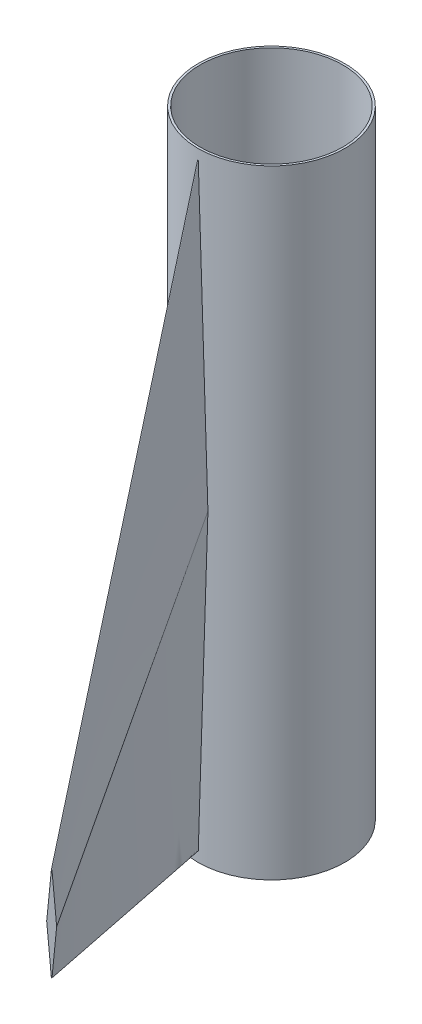
ISO-10303-21;
HEADER;
FILE_DESCRIPTION(('STEP AP214'),'2;1');
FILE_NAME('part.step','',(''),(''),'','','');
FILE_SCHEMA(('AUTOMOTIVE_DESIGN { 1 0 10303 214 1 1 1 1 }'));
ENDSEC;
DATA;
#1=APPLICATION_CONTEXT('core data for automotive mechanical design processes');
#2=APPLICATION_PROTOCOL_DEFINITION('international standard','automotive_design',2000,#1);
#3=PRODUCT_CONTEXT('',#1,'mechanical');
#4=PRODUCT('Part','Part','',(#3));
#5=PRODUCT_RELATED_PRODUCT_CATEGORY('part','',(#4));
#6=PRODUCT_DEFINITION_FORMATION('','',#4);
#7=PRODUCT_DEFINITION_CONTEXT('part definition',#1,'design');
#8=PRODUCT_DEFINITION('design','',#6,#7);
#9=PRODUCT_DEFINITION_SHAPE('','',#8);
#10=(LENGTH_UNIT() NAMED_UNIT(*) SI_UNIT(.MILLI.,.METRE.));
#11=(NAMED_UNIT(*) PLANE_ANGLE_UNIT() SI_UNIT($,.RADIAN.));
#12=(NAMED_UNIT(*) SI_UNIT($,.STERADIAN.) SOLID_ANGLE_UNIT());
#13=UNCERTAINTY_MEASURE_WITH_UNIT(LENGTH_MEASURE(1.E-05),#10,'distance_accuracy_value','');
#14=(GEOMETRIC_REPRESENTATION_CONTEXT(3) GLOBAL_UNCERTAINTY_ASSIGNED_CONTEXT((#13)) GLOBAL_UNIT_ASSIGNED_CONTEXT((#10,
#11,#12)) REPRESENTATION_CONTEXT('',''));
#15=CARTESIAN_POINT('',(0.,0.,0.));
#16=DIRECTION('',(0.,0.,1.));
#17=DIRECTION('',(1.,0.,0.));
#18=AXIS2_PLACEMENT_3D('',#15,#16,#17);
#19=CARTESIAN_POINT('',(0.,-10.1536657961174,83.947));
#20=DIRECTION('',(0.,0.,1.));
#21=DIRECTION('',(1.,0.,0.));
#22=AXIS2_PLACEMENT_3D('',#19,#20,#21);
#23=PLANE('',#22);
#24=DIRECTION('',(0.0995037190209991,-0.995037190209989,0.));
#25=VECTOR('',#24,1.);
#26=CARTESIAN_POINT('',(-1.90499999999998,7.61999999999998,83.947));
#27=LINE('',#26,#25);
#28=CARTESIAN_POINT('',(-1.90499999999998,7.61999999999998,83.947));
#29=VERTEX_POINT('',#28);
#30=CARTESIAN_POINT('',(-0.126369723156669,-10.1663027684331,83.947));
#31=VERTEX_POINT('',#30);
#32=EDGE_CURVE('E348',#29,#31,#27,.T.);
#33=ORIENTED_EDGE('',*,*,#32,.T.);
#34=CARTESIAN_POINT('',(0.,-10.1536657961174,83.947));
#35=DIRECTION('',(0.,0.,1.));
#36=DIRECTION('',(1.,0.,0.));
#37=AXIS2_PLACEMENT_3D('',#34,#35,#36);
#38=CIRCLE('',#37,0.127);
#39=CARTESIAN_POINT('',(0.126369723150859,-10.1663027684912,83.947));
#40=VERTEX_POINT('',#39);
#41=EDGE_CURVE('E443',#31,#40,#38,.T.);
#42=ORIENTED_EDGE('',*,*,#41,.T.);
#43=DIRECTION('',(0.0995037190210013,0.995037190209989,0.));
#44=VECTOR('',#43,1.);
#45=CARTESIAN_POINT('',(0.126369723156669,-10.1663027684331,83.947));
#46=LINE('',#45,#44);
#47=CARTESIAN_POINT('',(1.90500000000002,7.61999999999998,83.947));
#48=VERTEX_POINT('',#47);
#49=EDGE_CURVE('E392',#40,#48,#46,.T.);
#50=ORIENTED_EDGE('',*,*,#49,.T.);
#51=DIRECTION('',(-0.0995037190210009,0.995037190209989,0.));
#52=VECTOR('',#51,1.);
#53=CARTESIAN_POINT('',(1.90500000000002,7.61999999999998,83.947));
#54=LINE('',#53,#52);
#55=CARTESIAN_POINT('',(0.126369723156668,25.4063027684331,83.947));
#56=VERTEX_POINT('',#55);
#57=EDGE_CURVE('E404',#48,#56,#54,.T.);
#58=ORIENTED_EDGE('',*,*,#57,.T.);
#59=CARTESIAN_POINT('',(0.,25.3936657961175,83.947));
#60=DIRECTION('',(0.,0.,1.));
#61=DIRECTION('',(-1.,0.,0.));
#62=AXIS2_PLACEMENT_3D('',#59,#60,#61);
#63=CIRCLE('',#62,0.127000000000001);
#64=CARTESIAN_POINT('',(-0.126369723156669,25.4063027684331,83.947));
#65=VERTEX_POINT('',#64);
#66=EDGE_CURVE('E183',#56,#65,#63,.T.);
#67=ORIENTED_EDGE('',*,*,#66,.T.);
#68=DIRECTION('',(-0.0995037190209987,-0.995037190209989,0.));
#69=VECTOR('',#68,1.);
#70=CARTESIAN_POINT('',(-0.126369723156669,25.4063027684331,83.947));
#71=LINE('',#70,#69);
#72=EDGE_CURVE('E13',#65,#29,#71,.T.);
#73=ORIENTED_EDGE('',*,*,#72,.T.);
#74=EDGE_LOOP('',(#33,#42,#50,#58,#67,#73));
#75=FACE_BOUND('',#74,.T.);
#76=ADVANCED_FACE('F173',(#75),#23,.T.);
#77=CARTESIAN_POINT('',(0.,232.280952145505,28.067));
#78=DIRECTION('',(0.,0.,-1.));
#79=DIRECTION('',(-1.,0.,0.));
#80=AXIS2_PLACEMENT_3D('',#77,#78,#79);
#81=PLANE('',#80);
#82=DIRECTION('',(-0.032241294010958,-0.9994801143397,0.));
#83=VECTOR('',#82,1.);
#84=CARTESIAN_POINT('',(-3.81,118.11,28.067));
#85=LINE('',#84,#83);
#86=CARTESIAN_POINT('',(-0.126933974521144,232.285046789845,28.067));
#87=VERTEX_POINT('',#86);
#88=CARTESIAN_POINT('',(-3.81,118.11,28.067));
#89=VERTEX_POINT('',#88);
#90=EDGE_CURVE('E302',#87,#89,#85,.T.);
#91=ORIENTED_EDGE('',*,*,#90,.F.);
#92=CARTESIAN_POINT('',(0.,232.280952145505,28.067));
#93=DIRECTION('',(0.,0.,1.));
#94=DIRECTION('',(-1.,0.,0.));
#95=AXIS2_PLACEMENT_3D('',#92,#93,#94);
#96=CIRCLE('',#95,0.127000000000001);
#97=CARTESIAN_POINT('',(0.126933974521298,232.28504678984,28.067));
#98=VERTEX_POINT('',#97);
#99=EDGE_CURVE('E294',#98,#87,#96,.T.);
#100=ORIENTED_EDGE('',*,*,#99,.F.);
#101=DIRECTION('',(-0.032241294010958,0.9994801143397,0.));
#102=VECTOR('',#101,1.);
#103=CARTESIAN_POINT('',(0.126933974521142,232.285046789845,28.067));
#104=LINE('',#103,#102);
#105=CARTESIAN_POINT('',(3.81,118.11,28.067));
#106=VERTEX_POINT('',#105);
#107=EDGE_CURVE('E301',#106,#98,#104,.T.);
#108=ORIENTED_EDGE('',*,*,#107,.F.);
#109=DIRECTION('',(0.032241294010958,0.9994801143397,0.));
#110=VECTOR('',#109,1.);
#111=CARTESIAN_POINT('',(3.81,118.11,28.067));
#112=LINE('',#111,#110);
#113=CARTESIAN_POINT('',(0.126933974521142,3.93495321015537,28.067));
#114=VERTEX_POINT('',#113);
#115=EDGE_CURVE('E245',#114,#106,#112,.T.);
#116=ORIENTED_EDGE('',*,*,#115,.F.);
#117=CARTESIAN_POINT('',(0.,3.93904785449476,28.067));
#118=DIRECTION('',(0.,0.,1.));
#119=DIRECTION('',(1.,0.,0.));
#120=AXIS2_PLACEMENT_3D('',#117,#118,#119);
#121=CIRCLE('',#120,0.127);
#122=CARTESIAN_POINT('',(-0.126933974521142,3.93495321015537,28.067));
#123=VERTEX_POINT('',#122);
#124=EDGE_CURVE('E231',#123,#114,#121,.T.);
#125=ORIENTED_EDGE('',*,*,#124,.F.);
#126=DIRECTION('',(0.032241294010958,-0.9994801143397,0.));
#127=VECTOR('',#126,1.);
#128=CARTESIAN_POINT('',(-0.126933974521142,3.93495321015537,28.067));
#129=LINE('',#128,#127);
#130=EDGE_CURVE('E227',#89,#123,#129,.T.);
#131=ORIENTED_EDGE('',*,*,#130,.F.);
#132=EDGE_LOOP('',(#91,#100,#108,#116,#125,#131));
#133=FACE_BOUND('',#132,.T.);
#134=ADVANCED_FACE('F243',(#133),#81,.T.);
#135=CARTESIAN_POINT('',(3.81,118.11,28.067));
#136=CARTESIAN_POINT('',(1.90500000000002,7.61999999999998,83.947));
#137=CARTESIAN_POINT('',(3.50307783121009,127.624587232487,28.067));
#138=CARTESIAN_POINT('',(1.75678081026307,9.10219189736941,83.947));
#139=CARTESIAN_POINT('',(2.88789948556245,146.695115947564,28.0670000000001));
#140=CARTESIAN_POINT('',(1.46097839651669,12.0602160348332,83.947));
#141=CARTESIAN_POINT('',(1.96412683384105,175.332068150927,28.0669999999999));
#142=CARTESIAN_POINT('',(1.01774963437348,16.4925036562652,83.947));
#143=CARTESIAN_POINT('',(1.04238227972015,203.906149328676,28.067));
#144=CARTESIAN_POINT('',(0.573579452078329,20.9342054792166,83.947));
#145=CARTESIAN_POINT('',(0.431216773587377,222.852280018791,28.067));
#146=CARTESIAN_POINT('',(0.275874643443589,23.911253565564,83.947));
#147=CARTESIAN_POINT('',(0.12647280720979,232.299342976497,28.067));
#148=CARTESIAN_POINT('',(0.126143135316821,25.4085686468316,83.947));
#149=CARTESIAN_POINT('',(0.123006001641565,232.313332636363,28.067));
#150=CARTESIAN_POINT('',(0.125591006683148,25.4132938509938,83.947));
#151=CARTESIAN_POINT('',(0.115080241131872,232.337224944049,28.067));
#152=CARTESIAN_POINT('',(0.12387653668739,25.4234418009588,83.947));
#153=CARTESIAN_POINT('',(0.10298292957758,232.356231660063,28.0670000000001));
#154=CARTESIAN_POINT('',(0.120187298615999,25.4372916643276,83.947));
#155=CARTESIAN_POINT('',(0.0873430730521105,232.374246119639,28.0669999999999));
#156=CARTESIAN_POINT('',(0.111999966532673,25.4553178949072,83.947));
#157=CARTESIAN_POINT('',(0.0706757419898316,232.387000998075,28.067));
#158=CARTESIAN_POINT('',(0.0987659825767379,25.4742930331006,83.947));
#159=CARTESIAN_POINT('',(0.0534840654306137,232.396721358122,28.067));
#160=CARTESIAN_POINT('',(0.0791989412732428,25.4937595919846,83.947));
#161=CARTESIAN_POINT('',(0.0358549106874474,232.403222585661,28.067));
#162=CARTESIAN_POINT('',(0.0550930989734053,25.5098406082398,83.947));
#163=CARTESIAN_POINT('',(0.0179913415184863,232.407124878525,28.067));
#164=CARTESIAN_POINT('',(0.0282427120284333,25.5186591185468,83.947));
#165=CARTESIAN_POINT('',(-6.81906938308432E-07,232.408360384082,28.067));
#166=CARTESIAN_POINT('',(2.67162200506543E-05,25.5212586998027,83.947));
#167=CARTESIAN_POINT('',(-0.0179916290600238,232.40712183328,28.067));
#168=CARTESIAN_POINT('',(-0.0281759526700463,25.5186829289047,83.947));
#169=CARTESIAN_POINT('',(-0.035855075640821,232.403224606797,28.067));
#170=CARTESIAN_POINT('',(-0.0550196805766023,25.5099005812458,83.947));
#171=CARTESIAN_POINT('',(-0.0534839432323518,232.396720212646,28.067));
#172=CARTESIAN_POINT('',(-0.0791588534343684,25.4938804322188,83.947));
#173=CARTESIAN_POINT('',(-0.0706758184673015,232.387001668111,28.067));
#174=CARTESIAN_POINT('',(-0.0987662668883889,25.474454650203,83.947));
#175=CARTESIAN_POINT('',(-0.087343031921528,232.374245763825,28.067));
#176=CARTESIAN_POINT('',(-0.112014716583718,25.4554554035776,83.947));
#177=CARTESIAN_POINT('',(-0.102982952875664,232.356231861072,28.0669999999999));
#178=CARTESIAN_POINT('',(-0.120200133832751,25.4373715801386,83.947));
#179=CARTESIAN_POINT('',(-0.115080230297133,232.337224850641,28.067));
#180=CARTESIAN_POINT('',(-0.123882063928697,25.4234719864249,83.947));
#181=CARTESIAN_POINT('',(-0.12300600593899,232.313332673406,28.067));
#182=CARTESIAN_POINT('',(-0.125592023094703,25.4132989108431,83.947));
#183=CARTESIAN_POINT('',(-0.126472807209789,232.299342976497,28.067));
#184=CARTESIAN_POINT('',(-0.126143135316822,25.4085686468316,83.947));
#185=CARTESIAN_POINT('',(-0.431216773587378,222.852280018791,28.067));
#186=CARTESIAN_POINT('',(-0.275874643443587,23.9112535655639,83.947));
#187=CARTESIAN_POINT('',(-1.04238227972015,203.906149328675,28.067));
#188=CARTESIAN_POINT('',(-0.573579452078319,20.9342054792166,83.947));
#189=CARTESIAN_POINT('',(-1.96412683384106,175.332068150928,28.067));
#190=CARTESIAN_POINT('',(-1.01774963437346,16.4925036562651,83.947));
#191=CARTESIAN_POINT('',(-2.88789948556245,146.695115947564,28.067));
#192=CARTESIAN_POINT('',(-1.46097839651666,12.0602160348332,83.947));
#193=CARTESIAN_POINT('',(-3.50307783121009,127.624587232487,28.067));
#194=CARTESIAN_POINT('',(-1.75678081026304,9.10219189736941,83.947));
#195=CARTESIAN_POINT('',(-3.81,118.11,28.067));
#196=CARTESIAN_POINT('',(-1.90499999999998,7.61999999999998,83.947));
#197=B_SPLINE_SURFACE_WITH_KNOTS('',3,1,((#135,#136),(#137,#138),(#139,#140),(#141,#142),(#143,
#144),(#145,#146),(#147,#148),(#149,#150),(#151,#152),(#153,#154),(#155,#156),(#157,#158),(#159,
#160),(#161,#162),(#163,#164),(#165,#166),(#167,#168),(#169,#170),(#171,#172),(#173,#174),(#175,
#176),(#177,#178),(#179,#180),(#181,#182),(#183,#184),(#185,#186),(#187,#188),(#189,#190),(#191,
#192),(#193,#194),(#195,#196)),.UNSPECIFIED.,.F.,.F.,.F.,(4,1,1,1,2,1,1,1,1,1,1,1,1,1,1,1,1,1,1,
1,1,1,2,1,1,1,4),(2,2),(0.,0.124246772402648,0.248493544805297,0.372740317207945,
0.496987089610593,0.497175396509931,0.497363703409269,0.497740317207945,0.498116931006621,
0.498493544805297,0.498870158603972,0.499246772402648,0.499623386201324,0.5,0.500376613798675,
0.500753227597351,0.501129841396027,0.501506455194703,0.501883068993379,0.502259682792055,
0.502636296590731,0.502824603490069,0.503012910389407,0.627259682792055,0.751506455194703,
0.875753227597352,1.),(0.,1.),.UNSPECIFIED.);
#198=DIRECTION('',(0.0153838062642098,-0.892260763324158,0.451258317083482));
#199=VECTOR('',#198,1.);
#200=CARTESIAN_POINT('',(-2.85749999999999,62.865,56.007));
#201=LINE('',#200,#199);
#202=EDGE_CURVE('E234',#89,#29,#201,.T.);
#203=DIRECTION('',(0.0153838062642094,0.892260763324158,-0.451258317083482));
#204=VECTOR('',#203,1.);
#205=CARTESIAN_POINT('',(2.85750000000001,62.865,56.007));
#206=LINE('',#205,#204);
#207=EDGE_CURVE('E239',#48,#106,#206,.T.);
#208=ORIENTED_EDGE('',*,*,#107,.T.);
#209=ORIENTED_EDGE('',*,*,#99,.T.);
#210=ORIENTED_EDGE('',*,*,#90,.T.);
#211=ORIENTED_EDGE('',*,*,#202,.T.);
#212=ORIENTED_EDGE('',*,*,#72,.F.);
#213=ORIENTED_EDGE('',*,*,#66,.F.);
#214=ORIENTED_EDGE('',*,*,#57,.F.);
#215=ORIENTED_EDGE('',*,*,#207,.T.);
#216=EDGE_LOOP('',(#208,#209,#210,#211,#212,#213,#214,#215));
#217=FACE_BOUND('',#216,.T.);
#218=ADVANCED_FACE('F264',(#217),#197,.T.);
#219=CARTESIAN_POINT('',(-3.81,118.11,28.067));
#220=CARTESIAN_POINT('',(-1.90499999999998,7.61999999999998,83.947));
#221=CARTESIAN_POINT('',(-3.50307783121009,108.595412767513,28.067));
#222=CARTESIAN_POINT('',(-1.75678081026304,6.13780810263056,83.947));
#223=CARTESIAN_POINT('',(-2.88789948556245,89.5248840524359,28.067));
#224=CARTESIAN_POINT('',(-1.46097839651666,3.1797839651668,83.947));
#225=CARTESIAN_POINT('',(-1.96412683384105,60.8879318490727,28.067));
#226=CARTESIAN_POINT('',(-1.01774963437346,-1.25250365626517,83.947));
#227=CARTESIAN_POINT('',(-1.04238227972015,32.3138506713245,28.067));
#228=CARTESIAN_POINT('',(-0.573579452078318,-5.6942054792166,83.947));
#229=CARTESIAN_POINT('',(-0.431216773587377,13.3677199812087,28.067));
#230=CARTESIAN_POINT('',(-0.275874643443587,-8.67125356556391,83.947));
#231=CARTESIAN_POINT('',(-0.12647280720979,3.92065702350346,28.067));
#232=CARTESIAN_POINT('',(-0.126143135316822,-10.1685686468316,83.947));
#233=CARTESIAN_POINT('',(-0.123006001641572,3.90666736363665,28.067));
#234=CARTESIAN_POINT('',(-0.125591006683149,-10.1732938509938,83.947));
#235=CARTESIAN_POINT('',(-0.115080241131855,3.8827750559516,28.067));
#236=CARTESIAN_POINT('',(-0.123876536687392,-10.1834418009587,83.947));
#237=CARTESIAN_POINT('',(-0.102982929577606,3.86376833993637,28.067));
#238=CARTESIAN_POINT('',(-0.120187298616003,-10.1972916643276,83.9470000000001));
#239=CARTESIAN_POINT('',(-0.0873430730520864,3.84575388036119,28.067));
#240=CARTESIAN_POINT('',(-0.111999966532677,-10.2153178949071,83.9470000000001));
#241=CARTESIAN_POINT('',(-0.0706757419898456,3.83299900192514,28.0669999999999));
#242=CARTESIAN_POINT('',(-0.0987659825767418,-10.2342930331005,83.947));
#243=CARTESIAN_POINT('',(-0.0534840654306042,3.82327864187857,28.0670000000001));
#244=CARTESIAN_POINT('',(-0.0791989412732458,-10.2537595919846,83.9469999999999));
#245=CARTESIAN_POINT('',(-0.0358549106874444,3.81677741433884,28.0669999999999));
#246=CARTESIAN_POINT('',(-0.0550930989734052,-10.2698406082398,83.9469999999999));
#247=CARTESIAN_POINT('',(-0.0179913415184797,3.81287512147498,28.0670000000001));
#248=CARTESIAN_POINT('',(-0.0282427120284356,-10.2786591185468,83.947));
#249=CARTESIAN_POINT('',(6.81906954070021E-07,3.81163961591812,28.067));
#250=CARTESIAN_POINT('',(-2.67162200408686E-05,-10.2812586998027,83.9470000000001));
#251=CARTESIAN_POINT('',(0.0179916290600368,3.81287816671947,28.067));
#252=CARTESIAN_POINT('',(0.0281759526700584,-10.2786829289047,83.947));
#253=CARTESIAN_POINT('',(0.0358550756408423,3.8167753932025,28.067));
#254=CARTESIAN_POINT('',(0.0550196805766089,-10.2699005812457,83.9469999999999));
#255=CARTESIAN_POINT('',(0.0534839432323534,3.82327978735435,28.067));
#256=CARTESIAN_POINT('',(0.0791588534343662,-10.2538804322188,83.947));
#257=CARTESIAN_POINT('',(0.070675818467308,3.83299833188869,28.067));
#258=CARTESIAN_POINT('',(0.0987662668883904,-10.234454650203,83.9470000000001));
#259=CARTESIAN_POINT('',(0.0873430319215388,3.84575423617531,28.067));
#260=CARTESIAN_POINT('',(0.11201471658372,-10.2154554035776,83.9470000000001));
#261=CARTESIAN_POINT('',(0.102982952875676,3.86376813892814,28.067));
#262=CARTESIAN_POINT('',(0.120200133832751,-10.1973715801386,83.9470000000001));
#263=CARTESIAN_POINT('',(0.115080230297133,3.88277514935881,28.067));
#264=CARTESIAN_POINT('',(0.123882063928697,-10.1834719864248,83.947));
#265=CARTESIAN_POINT('',(0.123006005938988,3.90666732659413,28.067));
#266=CARTESIAN_POINT('',(0.125592023094703,-10.173298910843,83.947));
#267=CARTESIAN_POINT('',(0.12647280720979,3.92065702350345,28.067));
#268=CARTESIAN_POINT('',(0.126143135316822,-10.1685686468316,83.947));
#269=CARTESIAN_POINT('',(0.431216773587378,13.3677199812087,28.067));
#270=CARTESIAN_POINT('',(0.27587464344359,-8.67125356556391,83.947));
#271=CARTESIAN_POINT('',(1.04238227972015,32.3138506713246,28.067));
#272=CARTESIAN_POINT('',(0.573579452078329,-5.69420547921659,83.9469999999999));
#273=CARTESIAN_POINT('',(1.96412683384106,60.8879318490727,28.067));
#274=CARTESIAN_POINT('',(1.01774963437348,-1.25250365626517,83.947));
#275=CARTESIAN_POINT('',(2.88789948556245,89.524884052436,28.067));
#276=CARTESIAN_POINT('',(1.46097839651669,3.1797839651668,83.947));
#277=CARTESIAN_POINT('',(3.50307783121009,108.595412767513,28.067));
#278=CARTESIAN_POINT('',(1.75678081026307,6.13780810263056,83.947));
#279=CARTESIAN_POINT('',(3.81,118.11,28.067));
#280=CARTESIAN_POINT('',(1.90500000000002,7.61999999999998,83.947));
#281=B_SPLINE_SURFACE_WITH_KNOTS('',3,1,((#219,#220),(#221,#222),(#223,#224),(#225,#226),(#227,
#228),(#229,#230),(#231,#232),(#233,#234),(#235,#236),(#237,#238),(#239,#240),(#241,#242),(#243,
#244),(#245,#246),(#247,#248),(#249,#250),(#251,#252),(#253,#254),(#255,#256),(#257,#258),(#259,
#260),(#261,#262),(#263,#264),(#265,#266),(#267,#268),(#269,#270),(#271,#272),(#273,#274),(#275,
#276),(#277,#278),(#279,#280)),.UNSPECIFIED.,.F.,.F.,.F.,(4,1,1,1,2,1,1,1,1,1,1,1,1,1,1,1,1,1,1,
1,1,1,2,1,1,1,4),(2,2),(0.,0.124246772402648,0.248493544805297,0.372740317207945,
0.496987089610593,0.497175396509931,0.497363703409269,0.497740317207945,0.498116931006621,
0.498493544805297,0.498870158603972,0.499246772402648,0.499623386201324,0.5,0.500376613798676,
0.500753227597352,0.501129841396027,0.501506455194703,0.501883068993379,0.502259682792055,
0.50263629659073,0.502824603490068,0.503012910389406,0.627259682792055,0.751506455194703,
0.875753227597352,1.),(0.,1.),.UNSPECIFIED.);
#282=ORIENTED_EDGE('',*,*,#130,.T.);
#283=ORIENTED_EDGE('',*,*,#124,.T.);
#284=ORIENTED_EDGE('',*,*,#115,.T.);
#285=ORIENTED_EDGE('',*,*,#207,.F.);
#286=ORIENTED_EDGE('',*,*,#49,.F.);
#287=ORIENTED_EDGE('',*,*,#41,.F.);
#288=ORIENTED_EDGE('',*,*,#32,.F.);
#289=ORIENTED_EDGE('',*,*,#202,.F.);
#290=EDGE_LOOP('',(#282,#283,#284,#285,#286,#287,#288,#289));
#291=FACE_BOUND('',#290,.T.);
#292=ADVANCED_FACE('F230',(#291),#281,.T.);
#293=CLOSED_SHELL('',(#76,#134,#218,#292));
#294=MANIFOLD_SOLID_BREP('B2',#293);
#295=CARTESIAN_POINT('',(0.,236.22,0.));
#296=DIRECTION('',(0.,1.,0.));
#297=DIRECTION('',(0.,0.,1.));
#298=AXIS2_PLACEMENT_3D('',#295,#296,#297);
#299=PLANE('',#298);
#300=CARTESIAN_POINT('',(0.,236.22,0.));
#301=DIRECTION('',(0.,1.,0.));
#302=DIRECTION('',(0.,0.,1.));
#303=AXIS2_PLACEMENT_3D('',#300,#301,#302);
#304=CIRCLE('',#303,28.067);
#305=CARTESIAN_POINT('',(0.,236.22,28.067));
#306=VERTEX_POINT('',#305);
#307=EDGE_CURVE('E172',#306,#306,#304,.T.);
#308=ORIENTED_EDGE('',*,*,#307,.T.);
#309=EDGE_LOOP('',(#308));
#310=FACE_BOUND('',#309,.T.);
#311=CARTESIAN_POINT('',(0.,236.22,0.));
#312=DIRECTION('',(0.,1.,0.));
#313=DIRECTION('',(0.,0.,1.));
#314=AXIS2_PLACEMENT_3D('',#311,#312,#313);
#315=CIRCLE('',#314,27.2415);
#316=CARTESIAN_POINT('',(0.,236.22,27.2415));
#317=VERTEX_POINT('',#316);
#318=EDGE_CURVE('E594',#317,#317,#315,.T.);
#319=ORIENTED_EDGE('',*,*,#318,.F.);
#320=EDGE_LOOP('',(#319));
#321=FACE_BOUND('',#320,.T.);
#322=ADVANCED_FACE('F583',(#310,#321),#299,.T.);
#323=CARTESIAN_POINT('',(0.,0.,0.));
#324=DIRECTION('',(0.,1.,0.));
#325=DIRECTION('',(0.,0.,1.));
#326=AXIS2_PLACEMENT_3D('',#323,#324,#325);
#327=PLANE('',#326);
#328=CARTESIAN_POINT('',(0.,0.,0.));
#329=DIRECTION('',(0.,1.,0.));
#330=DIRECTION('',(0.,0.,1.));
#331=AXIS2_PLACEMENT_3D('',#328,#329,#330);
#332=CIRCLE('',#331,28.067);
#333=CARTESIAN_POINT('',(0.,0.,28.067));
#334=VERTEX_POINT('',#333);
#335=EDGE_CURVE('E587',#334,#334,#332,.T.);
#336=ORIENTED_EDGE('',*,*,#335,.F.);
#337=EDGE_LOOP('',(#336));
#338=FACE_BOUND('',#337,.T.);
#339=CARTESIAN_POINT('',(0.,0.,0.));
#340=DIRECTION('',(0.,1.,0.));
#341=DIRECTION('',(0.,0.,1.));
#342=AXIS2_PLACEMENT_3D('',#339,#340,#341);
#343=CIRCLE('',#342,27.2415);
#344=CARTESIAN_POINT('',(0.,0.,27.2415));
#345=VERTEX_POINT('',#344);
#346=EDGE_CURVE('E596',#345,#345,#343,.T.);
#347=ORIENTED_EDGE('',*,*,#346,.T.);
#348=EDGE_LOOP('',(#347));
#349=FACE_BOUND('',#348,.T.);
#350=ADVANCED_FACE('F606',(#338,#349),#327,.F.);
#351=CARTESIAN_POINT('',(0.,236.22,0.));
#352=DIRECTION('',(0.,-1.,0.));
#353=DIRECTION('',(0.,0.,-1.));
#354=AXIS2_PLACEMENT_3D('',#351,#352,#353);
#355=CYLINDRICAL_SURFACE('',#354,28.067);
#356=ORIENTED_EDGE('',*,*,#307,.F.);
#357=EDGE_LOOP('',(#356));
#358=FACE_BOUND('',#357,.T.);
#359=ORIENTED_EDGE('',*,*,#335,.T.);
#360=EDGE_LOOP('',(#359));
#361=FACE_BOUND('',#360,.T.);
#362=ADVANCED_FACE('F585',(#358,#361),#355,.T.);
#363=CARTESIAN_POINT('',(0.,236.22,0.));
#364=DIRECTION('',(0.,-1.,0.));
#365=DIRECTION('',(0.,0.,-1.));
#366=AXIS2_PLACEMENT_3D('',#363,#364,#365);
#367=CYLINDRICAL_SURFACE('',#366,27.2415);
#368=ORIENTED_EDGE('',*,*,#318,.T.);
#369=EDGE_LOOP('',(#368));
#370=FACE_BOUND('',#369,.T.);
#371=ORIENTED_EDGE('',*,*,#346,.F.);
#372=EDGE_LOOP('',(#371));
#373=FACE_BOUND('',#372,.T.);
#374=ADVANCED_FACE('F602',(#370,#373),#367,.F.);
#375=CLOSED_SHELL('',(#322,#350,#362,#374));
#376=MANIFOLD_SOLID_BREP('B7',#375);
#377=ADVANCED_BREP_SHAPE_REPRESENTATION('',(#18,#294,#376),#14);
#378=SHAPE_DEFINITION_REPRESENTATION(#9,#377);
ENDSEC;
END-ISO-10303-21;
